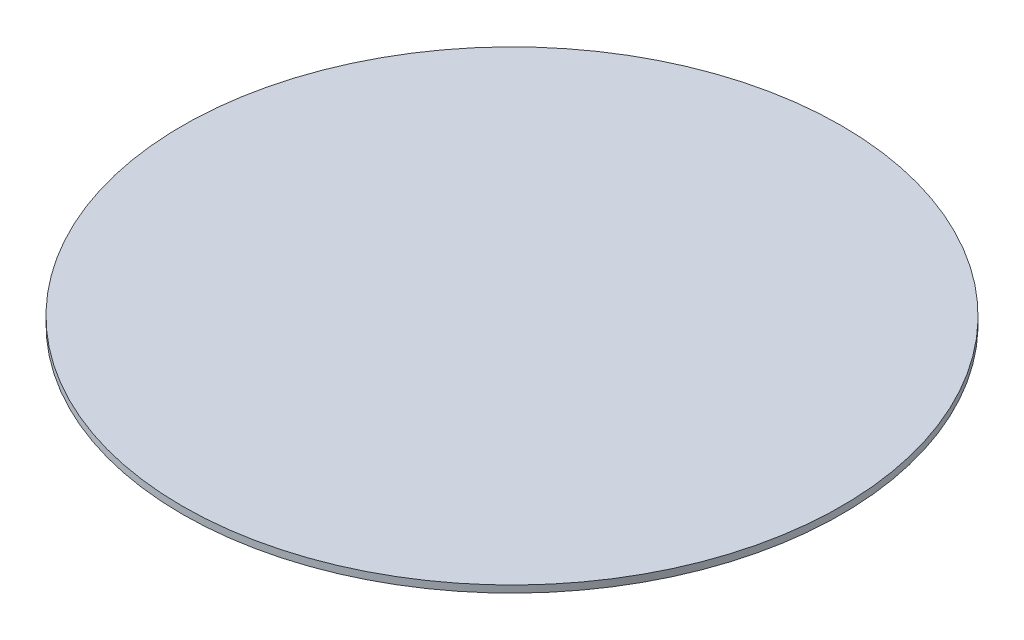
ISO-10303-21;
HEADER;
FILE_DESCRIPTION(('STEP AP214'),'2;1');
FILE_NAME('part.step','',(''),(''),'','','');
FILE_SCHEMA(('AUTOMOTIVE_DESIGN { 1 0 10303 214 1 1 1 1 }'));
ENDSEC;
DATA;
#1=APPLICATION_CONTEXT('core data for automotive mechanical design processes');
#2=APPLICATION_PROTOCOL_DEFINITION('international standard','automotive_design',2000,#1);
#3=PRODUCT_CONTEXT('',#1,'mechanical');
#4=PRODUCT('Part','Part','',(#3));
#5=PRODUCT_RELATED_PRODUCT_CATEGORY('part','',(#4));
#6=PRODUCT_DEFINITION_FORMATION('','',#4);
#7=PRODUCT_DEFINITION_CONTEXT('part definition',#1,'design');
#8=PRODUCT_DEFINITION('design','',#6,#7);
#9=PRODUCT_DEFINITION_SHAPE('','',#8);
#10=(LENGTH_UNIT() NAMED_UNIT(*) SI_UNIT(.MILLI.,.METRE.));
#11=(NAMED_UNIT(*) PLANE_ANGLE_UNIT() SI_UNIT($,.RADIAN.));
#12=(NAMED_UNIT(*) SI_UNIT($,.STERADIAN.) SOLID_ANGLE_UNIT());
#13=UNCERTAINTY_MEASURE_WITH_UNIT(LENGTH_MEASURE(1.E-05),#10,'distance_accuracy_value','');
#14=(GEOMETRIC_REPRESENTATION_CONTEXT(3) GLOBAL_UNCERTAINTY_ASSIGNED_CONTEXT((#13)) GLOBAL_UNIT_ASSIGNED_CONTEXT((#10,
#11,#12)) REPRESENTATION_CONTEXT('',''));
#15=CARTESIAN_POINT('',(0.,0.,0.));
#16=DIRECTION('',(0.,0.,1.));
#17=DIRECTION('',(1.,0.,0.));
#18=AXIS2_PLACEMENT_3D('',#15,#16,#17);
#19=CARTESIAN_POINT('',(0.,1.28,0.));
#20=DIRECTION('',(0.,-1.,0.));
#21=DIRECTION('',(0.,0.,-1.));
#22=AXIS2_PLACEMENT_3D('',#19,#20,#21);
#23=CYLINDRICAL_SURFACE('',#22,60.);
#24=CARTESIAN_POINT('',(0.,1.28,0.));
#25=DIRECTION('',(0.,1.,0.));
#26=DIRECTION('',(0.,0.,1.));
#27=AXIS2_PLACEMENT_3D('',#24,#25,#26);
#28=CIRCLE('',#27,60.);
#29=CARTESIAN_POINT('',(0.,1.28,-60.));
#30=VERTEX_POINT('',#29);
#31=EDGE_CURVE('E10',#30,#30,#28,.T.);
#32=CARTESIAN_POINT('',(0.,0.,0.));
#33=DIRECTION('',(0.,1.,0.));
#34=DIRECTION('',(0.,0.,1.));
#35=AXIS2_PLACEMENT_3D('',#32,#33,#34);
#36=CIRCLE('',#35,60.);
#37=CARTESIAN_POINT('',(0.,0.,-60.));
#38=VERTEX_POINT('',#37);
#39=EDGE_CURVE('E37',#38,#38,#36,.T.);
#40=CARTESIAN_POINT('',(0.,1.28,-60.));
#41=CARTESIAN_POINT('',(0.,1.26666666666667,-60.));
#42=CARTESIAN_POINT('',(0.,1.25333333333333,-60.));
#43=CARTESIAN_POINT('',(0.,1.22666666666667,-60.));
#44=CARTESIAN_POINT('',(0.,1.21333333333333,-60.));
#45=CARTESIAN_POINT('',(0.,1.18666666666667,-60.));
#46=CARTESIAN_POINT('',(0.,1.17333333333333,-60.));
#47=CARTESIAN_POINT('',(0.,1.14666666666667,-60.));
#48=CARTESIAN_POINT('',(0.,1.13333333333333,-60.));
#49=CARTESIAN_POINT('',(0.,1.10666666666667,-60.));
#50=CARTESIAN_POINT('',(0.,1.09333333333333,-60.));
#51=CARTESIAN_POINT('',(0.,1.06666666666667,-60.));
#52=CARTESIAN_POINT('',(0.,1.05333333333333,-60.));
#53=CARTESIAN_POINT('',(0.,1.02666666666667,-60.));
#54=CARTESIAN_POINT('',(0.,1.01333333333333,-60.));
#55=CARTESIAN_POINT('',(0.,0.986666666666667,-60.));
#56=CARTESIAN_POINT('',(0.,0.973333333333333,-60.));
#57=CARTESIAN_POINT('',(0.,0.946666666666667,-60.));
#58=CARTESIAN_POINT('',(0.,0.933333333333333,-60.));
#59=CARTESIAN_POINT('',(0.,0.906666666666667,-60.));
#60=CARTESIAN_POINT('',(0.,0.893333333333333,-60.));
#61=CARTESIAN_POINT('',(0.,0.866666666666667,-60.));
#62=CARTESIAN_POINT('',(0.,0.853333333333333,-60.));
#63=CARTESIAN_POINT('',(0.,0.826666666666667,-60.));
#64=CARTESIAN_POINT('',(0.,0.813333333333333,-60.));
#65=CARTESIAN_POINT('',(0.,0.786666666666667,-60.));
#66=CARTESIAN_POINT('',(0.,0.773333333333333,-60.));
#67=CARTESIAN_POINT('',(0.,0.746666666666667,-60.));
#68=CARTESIAN_POINT('',(0.,0.733333333333333,-60.));
#69=CARTESIAN_POINT('',(0.,0.706666666666667,-60.));
#70=CARTESIAN_POINT('',(0.,0.693333333333333,-60.));
#71=CARTESIAN_POINT('',(0.,0.666666666666667,-60.));
#72=CARTESIAN_POINT('',(0.,0.653333333333333,-60.));
#73=CARTESIAN_POINT('',(0.,0.626666666666667,-60.));
#74=CARTESIAN_POINT('',(0.,0.613333333333333,-60.));
#75=CARTESIAN_POINT('',(0.,0.586666666666667,-60.));
#76=CARTESIAN_POINT('',(0.,0.573333333333333,-60.));
#77=CARTESIAN_POINT('',(0.,0.546666666666667,-60.));
#78=CARTESIAN_POINT('',(0.,0.533333333333333,-60.));
#79=CARTESIAN_POINT('',(0.,0.506666666666667,-60.));
#80=CARTESIAN_POINT('',(0.,0.493333333333333,-60.));
#81=CARTESIAN_POINT('',(0.,0.466666666666667,-60.));
#82=CARTESIAN_POINT('',(0.,0.453333333333333,-60.));
#83=CARTESIAN_POINT('',(0.,0.426666666666667,-60.));
#84=CARTESIAN_POINT('',(0.,0.413333333333333,-60.));
#85=CARTESIAN_POINT('',(0.,0.386666666666667,-60.));
#86=CARTESIAN_POINT('',(0.,0.373333333333333,-60.));
#87=CARTESIAN_POINT('',(0.,0.346666666666667,-60.));
#88=CARTESIAN_POINT('',(0.,0.333333333333333,-60.));
#89=CARTESIAN_POINT('',(0.,0.306666666666667,-60.));
#90=CARTESIAN_POINT('',(0.,0.293333333333333,-60.));
#91=CARTESIAN_POINT('',(0.,0.266666666666667,-60.));
#92=CARTESIAN_POINT('',(0.,0.253333333333333,-60.));
#93=CARTESIAN_POINT('',(0.,0.226666666666667,-60.));
#94=CARTESIAN_POINT('',(0.,0.213333333333333,-60.));
#95=CARTESIAN_POINT('',(0.,0.186666666666667,-60.));
#96=CARTESIAN_POINT('',(0.,0.173333333333333,-60.));
#97=CARTESIAN_POINT('',(0.,0.146666666666667,-60.));
#98=CARTESIAN_POINT('',(0.,0.133333333333333,-60.));
#99=CARTESIAN_POINT('',(0.,0.106666666666667,-60.));
#100=CARTESIAN_POINT('',(0.,0.0933333333333334,-60.));
#101=CARTESIAN_POINT('',(0.,0.0666666666666667,-60.));
#102=CARTESIAN_POINT('',(0.,0.0533333333333334,-60.));
#103=CARTESIAN_POINT('',(0.,0.0266666666666667,-60.));
#104=CARTESIAN_POINT('',(0.,0.0133333333333334,-60.));
#105=CARTESIAN_POINT('',(0.,0.,-60.));
#106=B_SPLINE_CURVE_WITH_KNOTS('',3,(#40,#41,#42,#43,#44,#45,#46,#47,#48,#49,#50,#51,#52,#53,
#54,#55,#56,#57,#58,#59,#60,#61,#62,#63,#64,#65,#66,#67,#68,#69,#70,#71,#72,#73,#74,#75,#76,#77,
#78,#79,#80,#81,#82,#83,#84,#85,#86,#87,#88,#89,#90,#91,#92,#93,#94,#95,#96,#97,#98,#99,#100,
#101,#102,#103,#104,#105),.UNSPECIFIED.,.F.,.F.,(4,2,2,2,2,2,2,2,2,2,2,2,2,2,2,2,2,2,2,2,2,2,2,
2,2,2,2,2,2,2,2,2,4),(0.,0.0399999999999999,0.0799999999999998,0.12,0.16,0.2,0.24,0.28,0.32,
0.36,0.4,0.44,0.48,0.52,0.56,0.6,0.64,0.68,0.72,0.76,0.8,0.84,0.88,0.92,0.96,1.,1.04,1.08,1.12,
1.16,1.2,1.24,1.28),.UNSPECIFIED.);
#107=EDGE_CURVE('BSEAM34',#30,#38,#106,.T.);
#108=ORIENTED_EDGE('',*,*,#31,.F.);
#109=ORIENTED_EDGE('',*,*,#39,.T.);
#110=ORIENTED_EDGE('',*,*,#107,.T.);
#111=ORIENTED_EDGE('',*,*,#107,.F.);
#112=EDGE_LOOP('',(#108,#110,#109,#111));
#113=FACE_BOUND('',#112,.T.);
#114=ADVANCED_FACE('F34',(#113),#23,.T.);
#115=CARTESIAN_POINT('',(0.,1.28,0.));
#116=DIRECTION('',(0.,1.,0.));
#117=DIRECTION('',(0.,0.,1.));
#118=AXIS2_PLACEMENT_3D('',#115,#116,#117);
#119=PLANE('',#118);
#120=ORIENTED_EDGE('',*,*,#31,.T.);
#121=EDGE_LOOP('',(#120));
#122=FACE_BOUND('',#121,.T.);
#123=ADVANCED_FACE('F49',(#122),#119,.T.);
#124=CARTESIAN_POINT('',(0.,0.,0.));
#125=DIRECTION('',(0.,1.,0.));
#126=DIRECTION('',(0.,0.,1.));
#127=AXIS2_PLACEMENT_3D('',#124,#125,#126);
#128=PLANE('',#127);
#129=ORIENTED_EDGE('',*,*,#39,.F.);
#130=EDGE_LOOP('',(#129));
#131=FACE_BOUND('',#130,.T.);
#132=ADVANCED_FACE('F47',(#131),#128,.F.);
#133=CLOSED_SHELL('',(#114,#123,#132));
#134=MANIFOLD_SOLID_BREP('B2',#133);
#135=ADVANCED_BREP_SHAPE_REPRESENTATION('',(#18,#134),#14);
#136=SHAPE_DEFINITION_REPRESENTATION(#9,#135);
ENDSEC;
END-ISO-10303-21;
